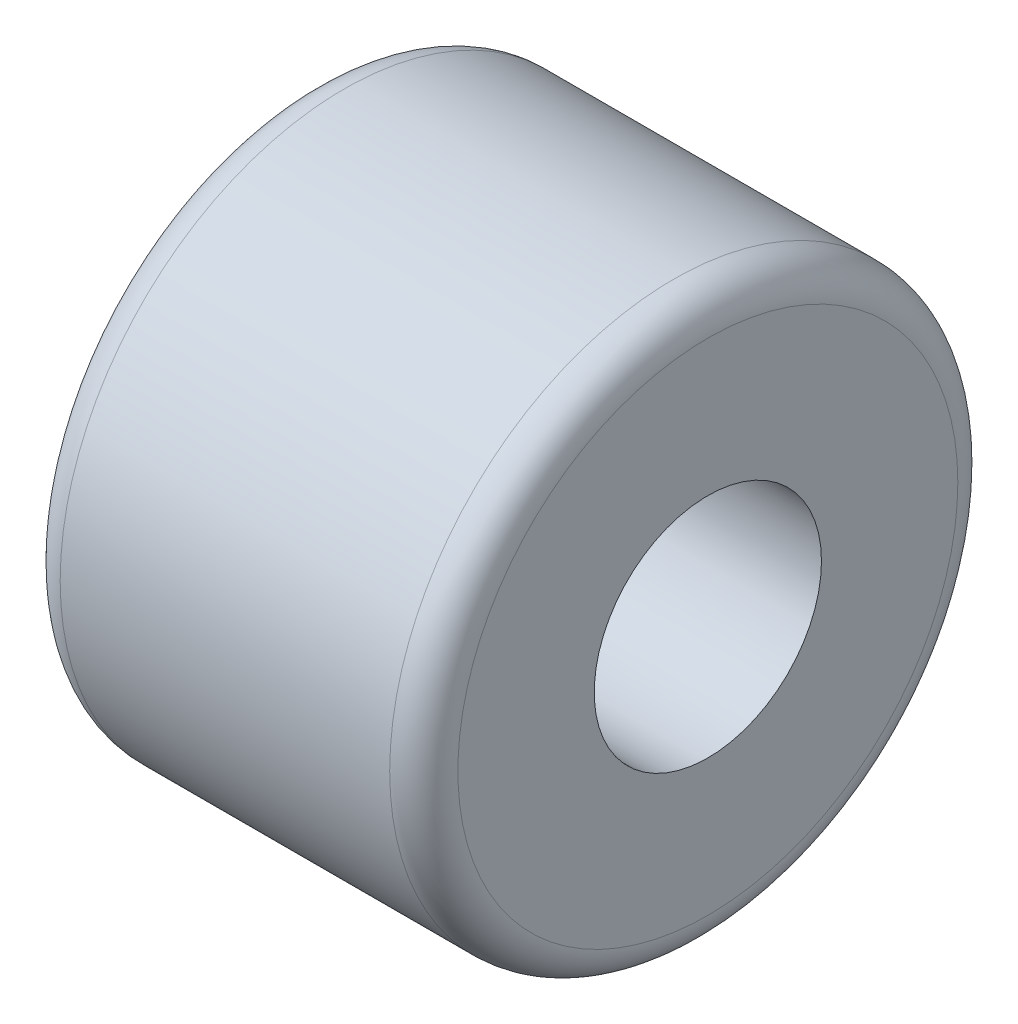
ISO-10303-21;
HEADER;
FILE_DESCRIPTION(('STEP AP214'),'2;1');
FILE_NAME('part.step','',(''),(''),'','','');
FILE_SCHEMA(('AUTOMOTIVE_DESIGN { 1 0 10303 214 1 1 1 1 }'));
ENDSEC;
DATA;
#1=APPLICATION_CONTEXT('core data for automotive mechanical design processes');
#2=APPLICATION_PROTOCOL_DEFINITION('international standard','automotive_design',2000,#1);
#3=PRODUCT_CONTEXT('',#1,'mechanical');
#4=PRODUCT('Part','Part','',(#3));
#5=PRODUCT_RELATED_PRODUCT_CATEGORY('part','',(#4));
#6=PRODUCT_DEFINITION_FORMATION('','',#4);
#7=PRODUCT_DEFINITION_CONTEXT('part definition',#1,'design');
#8=PRODUCT_DEFINITION('design','',#6,#7);
#9=PRODUCT_DEFINITION_SHAPE('','',#8);
#10=(LENGTH_UNIT() NAMED_UNIT(*) SI_UNIT(.MILLI.,.METRE.));
#11=(NAMED_UNIT(*) PLANE_ANGLE_UNIT() SI_UNIT($,.RADIAN.));
#12=(NAMED_UNIT(*) SI_UNIT($,.STERADIAN.) SOLID_ANGLE_UNIT());
#13=UNCERTAINTY_MEASURE_WITH_UNIT(LENGTH_MEASURE(1.E-05),#10,'distance_accuracy_value','');
#14=(GEOMETRIC_REPRESENTATION_CONTEXT(3) GLOBAL_UNCERTAINTY_ASSIGNED_CONTEXT((#13)) GLOBAL_UNIT_ASSIGNED_CONTEXT((#10,
#11,#12)) REPRESENTATION_CONTEXT('',''));
#15=CARTESIAN_POINT('',(0.,0.,0.));
#16=DIRECTION('',(0.,0.,1.));
#17=DIRECTION('',(1.,0.,0.));
#18=AXIS2_PLACEMENT_3D('',#15,#16,#17);
#19=CARTESIAN_POINT('',(35.,0.,0.));
#20=DIRECTION('',(-1.,0.,0.));
#21=DIRECTION('',(0.,0.,1.));
#22=AXIS2_PLACEMENT_3D('',#19,#20,#21);
#23=CYLINDRICAL_SURFACE('',#22,1.5);
#24=CARTESIAN_POINT('',(0.,0.,0.));
#25=DIRECTION('',(1.,0.,0.));
#26=DIRECTION('',(0.,0.,-1.));
#27=AXIS2_PLACEMENT_3D('',#24,#25,#26);
#28=CIRCLE('',#27,1.5);
#29=CARTESIAN_POINT('',(0.,0.,-1.5));
#30=VERTEX_POINT('',#29);
#31=EDGE_CURVE('E59',#30,#30,#28,.T.);
#32=ORIENTED_EDGE('',*,*,#31,.F.);
#33=EDGE_LOOP('',(#32));
#34=FACE_BOUND('',#33,.T.);
#35=CARTESIAN_POINT('',(15.,0.,0.));
#36=DIRECTION('',(1.,0.,0.));
#37=DIRECTION('',(0.,0.,-1.));
#38=AXIS2_PLACEMENT_3D('',#35,#36,#37);
#39=CIRCLE('',#38,1.5);
#40=CARTESIAN_POINT('',(15.,0.,-1.5));
#41=VERTEX_POINT('',#40);
#42=EDGE_CURVE('E60',#41,#41,#39,.T.);
#43=ORIENTED_EDGE('',*,*,#42,.T.);
#44=EDGE_LOOP('',(#43));
#45=FACE_BOUND('',#44,.T.);
#46=ADVANCED_FACE('F39',(#34,#45),#23,.F.);
#47=CARTESIAN_POINT('',(35.,0.,0.));
#48=DIRECTION('',(1.,0.,0.));
#49=DIRECTION('',(0.,0.,-1.));
#50=AXIS2_PLACEMENT_3D('',#47,#48,#49);
#51=PLANE('',#50);
#52=CARTESIAN_POINT('',(35.,0.,0.));
#53=DIRECTION('',(1.,0.,0.));
#54=DIRECTION('',(0.,0.,-1.));
#55=AXIS2_PLACEMENT_3D('',#52,#53,#54);
#56=CIRCLE('',#55,22.);
#57=CARTESIAN_POINT('',(35.,0.,-22.));
#58=VERTEX_POINT('',#57);
#59=EDGE_CURVE('E46',#58,#58,#56,.T.);
#60=ORIENTED_EDGE('',*,*,#59,.T.);
#61=EDGE_LOOP('',(#60));
#62=FACE_BOUND('',#61,.T.);
#63=CARTESIAN_POINT('',(35.,0.,0.));
#64=DIRECTION('',(1.,0.,0.));
#65=DIRECTION('',(0.,0.,-1.));
#66=AXIS2_PLACEMENT_3D('',#63,#64,#65);
#67=CIRCLE('',#66,10.);
#68=CARTESIAN_POINT('',(35.,0.,-10.));
#69=VERTEX_POINT('',#68);
#70=EDGE_CURVE('E66',#69,#69,#67,.T.);
#71=ORIENTED_EDGE('',*,*,#70,.F.);
#72=EDGE_LOOP('',(#71));
#73=FACE_BOUND('',#72,.T.);
#74=ADVANCED_FACE('F81',(#62,#73),#51,.T.);
#75=CARTESIAN_POINT('',(0.,0.,0.));
#76=DIRECTION('',(1.,0.,0.));
#77=DIRECTION('',(0.,0.,-1.));
#78=AXIS2_PLACEMENT_3D('',#75,#76,#77);
#79=PLANE('',#78);
#80=CARTESIAN_POINT('',(0.,0.,0.));
#81=DIRECTION('',(1.,0.,0.));
#82=DIRECTION('',(0.,0.,-1.));
#83=AXIS2_PLACEMENT_3D('',#80,#81,#82);
#84=CIRCLE('',#83,22.);
#85=CARTESIAN_POINT('',(0.,0.,-22.));
#86=VERTEX_POINT('',#85);
#87=EDGE_CURVE('E50',#86,#86,#84,.F.);
#88=ORIENTED_EDGE('',*,*,#87,.T.);
#89=EDGE_LOOP('',(#88));
#90=FACE_BOUND('',#89,.T.);
#91=ORIENTED_EDGE('',*,*,#31,.T.);
#92=EDGE_LOOP('',(#91));
#93=FACE_BOUND('',#92,.T.);
#94=ADVANCED_FACE('F83',(#90,#93),#79,.F.);
#95=CARTESIAN_POINT('',(35.,0.,0.));
#96=DIRECTION('',(-1.,0.,0.));
#97=DIRECTION('',(0.,0.,1.));
#98=AXIS2_PLACEMENT_3D('',#95,#96,#97);
#99=CYLINDRICAL_SURFACE('',#98,25.);
#100=CARTESIAN_POINT('',(32.,0.,0.));
#101=DIRECTION('',(1.,0.,0.));
#102=DIRECTION('',(0.,0.,-1.));
#103=AXIS2_PLACEMENT_3D('',#100,#101,#102);
#104=CIRCLE('',#103,25.);
#105=CARTESIAN_POINT('',(32.,0.,-25.));
#106=VERTEX_POINT('',#105);
#107=EDGE_CURVE('E10',#106,#106,#104,.F.);
#108=ORIENTED_EDGE('',*,*,#107,.T.);
#109=EDGE_LOOP('',(#108));
#110=FACE_BOUND('',#109,.T.);
#111=CARTESIAN_POINT('',(3.,0.,0.));
#112=DIRECTION('',(1.,0.,0.));
#113=DIRECTION('',(0.,0.,-1.));
#114=AXIS2_PLACEMENT_3D('',#111,#112,#113);
#115=CIRCLE('',#114,25.);
#116=CARTESIAN_POINT('',(3.,0.,-25.));
#117=VERTEX_POINT('',#116);
#118=EDGE_CURVE('E54',#117,#117,#115,.T.);
#119=ORIENTED_EDGE('',*,*,#118,.T.);
#120=EDGE_LOOP('',(#119));
#121=FACE_BOUND('',#120,.T.);
#122=ADVANCED_FACE('F77',(#110,#121),#99,.T.);
#123=CARTESIAN_POINT('',(15.,0.,0.));
#124=DIRECTION('',(1.,0.,0.));
#125=DIRECTION('',(0.,0.,-1.));
#126=AXIS2_PLACEMENT_3D('',#123,#124,#125);
#127=CYLINDRICAL_SURFACE('',#126,10.);
#128=CARTESIAN_POINT('',(15.,0.,0.));
#129=DIRECTION('',(1.,0.,0.));
#130=DIRECTION('',(0.,0.,-1.));
#131=AXIS2_PLACEMENT_3D('',#128,#129,#130);
#132=CIRCLE('',#131,10.);
#133=CARTESIAN_POINT('',(15.,0.,-10.));
#134=VERTEX_POINT('',#133);
#135=EDGE_CURVE('E63',#134,#134,#132,.T.);
#136=ORIENTED_EDGE('',*,*,#135,.F.);
#137=EDGE_LOOP('',(#136));
#138=FACE_BOUND('',#137,.T.);
#139=ORIENTED_EDGE('',*,*,#70,.T.);
#140=EDGE_LOOP('',(#139));
#141=FACE_BOUND('',#140,.T.);
#142=ADVANCED_FACE('F74',(#138,#141),#127,.F.);
#143=CARTESIAN_POINT('',(15.,0.,0.));
#144=DIRECTION('',(1.,0.,0.));
#145=DIRECTION('',(0.,0.,-1.));
#146=AXIS2_PLACEMENT_3D('',#143,#144,#145);
#147=PLANE('',#146);
#148=ORIENTED_EDGE('',*,*,#42,.F.);
#149=EDGE_LOOP('',(#148));
#150=FACE_BOUND('',#149,.T.);
#151=ORIENTED_EDGE('',*,*,#135,.T.);
#152=EDGE_LOOP('',(#151));
#153=FACE_BOUND('',#152,.T.);
#154=ADVANCED_FACE('F72',(#150,#153),#147,.T.);
#155=CARTESIAN_POINT('',(3.,0.,0.));
#156=DIRECTION('',(1.,0.,0.));
#157=DIRECTION('',(0.,0.,-1.));
#158=AXIS2_PLACEMENT_3D('',#155,#156,#157);
#159=TOROIDAL_SURFACE('',#158,22.,3.);
#160=ORIENTED_EDGE('',*,*,#87,.F.);
#161=EDGE_LOOP('',(#160));
#162=FACE_BOUND('',#161,.T.);
#163=ORIENTED_EDGE('',*,*,#118,.F.);
#164=EDGE_LOOP('',(#163));
#165=FACE_BOUND('',#164,.T.);
#166=ADVANCED_FACE('F96',(#162,#165),#159,.T.);
#167=CARTESIAN_POINT('',(32.,0.,0.));
#168=DIRECTION('',(1.,0.,0.));
#169=DIRECTION('',(0.,0.,-1.));
#170=AXIS2_PLACEMENT_3D('',#167,#168,#169);
#171=TOROIDAL_SURFACE('',#170,22.,3.);
#172=ORIENTED_EDGE('',*,*,#107,.F.);
#173=EDGE_LOOP('',(#172));
#174=FACE_BOUND('',#173,.T.);
#175=ORIENTED_EDGE('',*,*,#59,.F.);
#176=EDGE_LOOP('',(#175));
#177=FACE_BOUND('',#176,.T.);
#178=ADVANCED_FACE('F41',(#174,#177),#171,.T.);
#179=CLOSED_SHELL('',(#46,#74,#94,#122,#142,#154,#166,#178));
#180=MANIFOLD_SOLID_BREP('B2',#179);
#181=ADVANCED_BREP_SHAPE_REPRESENTATION('',(#18,#180),#14);
#182=SHAPE_DEFINITION_REPRESENTATION(#9,#181);
ENDSEC;
END-ISO-10303-21;
